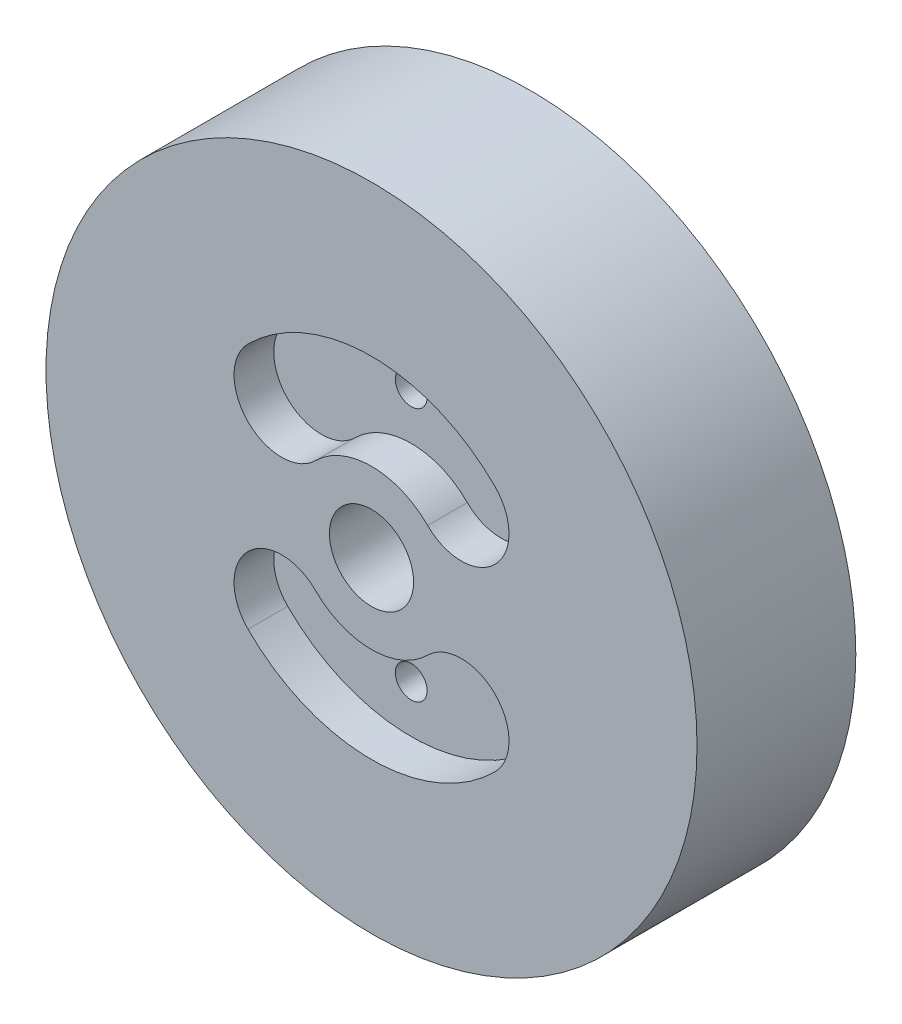
ISO-10303-21;
HEADER;
FILE_DESCRIPTION(('STEP AP214'),'2;1');
FILE_NAME('part.step','',(''),(''),'','','');
FILE_SCHEMA(('AUTOMOTIVE_DESIGN { 1 0 10303 214 1 1 1 1 }'));
ENDSEC;
DATA;
#1=APPLICATION_CONTEXT('core data for automotive mechanical design processes');
#2=APPLICATION_PROTOCOL_DEFINITION('international standard','automotive_design',2000,#1);
#3=PRODUCT_CONTEXT('',#1,'mechanical');
#4=PRODUCT('Part','Part','',(#3));
#5=PRODUCT_RELATED_PRODUCT_CATEGORY('part','',(#4));
#6=PRODUCT_DEFINITION_FORMATION('','',#4);
#7=PRODUCT_DEFINITION_CONTEXT('part definition',#1,'design');
#8=PRODUCT_DEFINITION('design','',#6,#7);
#9=PRODUCT_DEFINITION_SHAPE('','',#8);
#10=(LENGTH_UNIT() NAMED_UNIT(*) SI_UNIT(.MILLI.,.METRE.));
#11=(NAMED_UNIT(*) PLANE_ANGLE_UNIT() SI_UNIT($,.RADIAN.));
#12=(NAMED_UNIT(*) SI_UNIT($,.STERADIAN.) SOLID_ANGLE_UNIT());
#13=UNCERTAINTY_MEASURE_WITH_UNIT(LENGTH_MEASURE(1.E-05),#10,'distance_accuracy_value','');
#14=(GEOMETRIC_REPRESENTATION_CONTEXT(3) GLOBAL_UNCERTAINTY_ASSIGNED_CONTEXT((#13)) GLOBAL_UNIT_ASSIGNED_CONTEXT((#10,
#11,#12)) REPRESENTATION_CONTEXT('',''));
#15=CARTESIAN_POINT('',(0.,0.,0.));
#16=DIRECTION('',(0.,0.,1.));
#17=DIRECTION('',(1.,0.,0.));
#18=AXIS2_PLACEMENT_3D('',#15,#16,#17);
#19=CARTESIAN_POINT('',(0.,0.,5.));
#20=DIRECTION('',(0.,0.,-1.));
#21=DIRECTION('',(-1.,0.,0.));
#22=AXIS2_PLACEMENT_3D('',#19,#20,#21);
#23=CYLINDRICAL_SURFACE('',#22,20.5);
#24=CARTESIAN_POINT('',(0.,0.,5.));
#25=DIRECTION('',(0.,0.,1.));
#26=DIRECTION('',(1.,0.,0.));
#27=AXIS2_PLACEMENT_3D('',#24,#25,#26);
#28=CIRCLE('',#27,20.5);
#29=CARTESIAN_POINT('',(20.5,0.,5.));
#30=VERTEX_POINT('',#29);
#31=EDGE_CURVE('E11',#30,#30,#28,.T.);
#32=ORIENTED_EDGE('',*,*,#31,.F.);
#33=EDGE_LOOP('',(#32));
#34=FACE_BOUND('',#33,.T.);
#35=CARTESIAN_POINT('',(0.,0.,-5.));
#36=DIRECTION('',(0.,0.,1.));
#37=DIRECTION('',(1.,0.,0.));
#38=AXIS2_PLACEMENT_3D('',#35,#36,#37);
#39=CIRCLE('',#38,20.5);
#40=CARTESIAN_POINT('',(20.5,0.,-5.));
#41=VERTEX_POINT('',#40);
#42=EDGE_CURVE('E35',#41,#41,#39,.T.);
#43=ORIENTED_EDGE('',*,*,#42,.T.);
#44=EDGE_LOOP('',(#43));
#45=FACE_BOUND('',#44,.T.);
#46=ADVANCED_FACE('F32',(#34,#45),#23,.T.);
#47=CARTESIAN_POINT('',(0.,0.,5.));
#48=DIRECTION('',(0.,0.,1.));
#49=DIRECTION('',(1.,0.,0.));
#50=AXIS2_PLACEMENT_3D('',#47,#48,#49);
#51=PLANE('',#50);
#52=CARTESIAN_POINT('',(-5.65685424949237,-5.65685424949239,5.));
#53=DIRECTION('',(0.,0.,1.));
#54=DIRECTION('',(-1.,0.,0.));
#55=AXIS2_PLACEMENT_3D('',#52,#53,#54);
#56=CIRCLE('',#55,3.);
#57=CARTESIAN_POINT('',(-3.53553390593273,-3.53553390593274,5.));
#58=VERTEX_POINT('',#57);
#59=CARTESIAN_POINT('',(-7.77817459305201,-7.77817459305204,5.));
#60=VERTEX_POINT('',#59);
#61=EDGE_CURVE('E46',#58,#60,#56,.T.);
#62=ORIENTED_EDGE('',*,*,#61,.F.);
#63=CARTESIAN_POINT('',(0.,0.,5.));
#64=DIRECTION('',(0.,0.,-1.));
#65=DIRECTION('',(-1.,0.,0.));
#66=AXIS2_PLACEMENT_3D('',#63,#64,#65);
#67=CIRCLE('',#66,5.);
#68=CARTESIAN_POINT('',(3.53553390593273,-3.53553390593274,5.));
#69=VERTEX_POINT('',#68);
#70=EDGE_CURVE('E116',#69,#58,#67,.T.);
#71=ORIENTED_EDGE('',*,*,#70,.F.);
#72=CARTESIAN_POINT('',(5.65685424949237,-5.65685424949239,5.));
#73=DIRECTION('',(0.,0.,1.));
#74=DIRECTION('',(-1.,0.,0.));
#75=AXIS2_PLACEMENT_3D('',#72,#73,#74);
#76=CIRCLE('',#75,3.);
#77=CARTESIAN_POINT('',(7.77817459305201,-7.77817459305204,5.));
#78=VERTEX_POINT('',#77);
#79=EDGE_CURVE('E119',#78,#69,#76,.T.);
#80=ORIENTED_EDGE('',*,*,#79,.F.);
#81=CARTESIAN_POINT('',(0.,0.,5.));
#82=DIRECTION('',(0.,0.,1.));
#83=DIRECTION('',(-1.,0.,0.));
#84=AXIS2_PLACEMENT_3D('',#81,#82,#83);
#85=CIRCLE('',#84,11.);
#86=EDGE_CURVE('E128',#60,#78,#85,.T.);
#87=ORIENTED_EDGE('',*,*,#86,.F.);
#88=EDGE_LOOP('',(#62,#71,#80,#87));
#89=FACE_BOUND('',#88,.T.);
#90=CARTESIAN_POINT('',(5.65685424949237,5.65685424949239,5.));
#91=DIRECTION('',(0.,0.,1.));
#92=DIRECTION('',(1.,0.,0.));
#93=AXIS2_PLACEMENT_3D('',#90,#91,#92);
#94=CIRCLE('',#93,3.);
#95=CARTESIAN_POINT('',(3.53553390593273,3.53553390593274,5.));
#96=VERTEX_POINT('',#95);
#97=CARTESIAN_POINT('',(7.77817459305201,7.77817459305204,5.));
#98=VERTEX_POINT('',#97);
#99=EDGE_CURVE('E54',#96,#98,#94,.T.);
#100=ORIENTED_EDGE('',*,*,#99,.F.);
#101=CARTESIAN_POINT('',(0.,0.,5.));
#102=DIRECTION('',(0.,0.,-1.));
#103=DIRECTION('',(1.,0.,0.));
#104=AXIS2_PLACEMENT_3D('',#101,#102,#103);
#105=CIRCLE('',#104,5.);
#106=CARTESIAN_POINT('',(-3.53553390593273,3.53553390593274,5.));
#107=VERTEX_POINT('',#106);
#108=EDGE_CURVE('E147',#107,#96,#105,.T.);
#109=ORIENTED_EDGE('',*,*,#108,.F.);
#110=CARTESIAN_POINT('',(-5.65685424949237,5.65685424949239,5.));
#111=DIRECTION('',(0.,0.,1.));
#112=DIRECTION('',(1.,0.,0.));
#113=AXIS2_PLACEMENT_3D('',#110,#111,#112);
#114=CIRCLE('',#113,3.);
#115=CARTESIAN_POINT('',(-7.77817459305201,7.77817459305204,5.));
#116=VERTEX_POINT('',#115);
#117=EDGE_CURVE('E161',#116,#107,#114,.T.);
#118=ORIENTED_EDGE('',*,*,#117,.F.);
#119=CARTESIAN_POINT('',(0.,0.,5.));
#120=DIRECTION('',(0.,0.,1.));
#121=DIRECTION('',(1.,0.,0.));
#122=AXIS2_PLACEMENT_3D('',#119,#120,#121);
#123=CIRCLE('',#122,11.);
#124=EDGE_CURVE('E158',#98,#116,#123,.T.);
#125=ORIENTED_EDGE('',*,*,#124,.F.);
#126=EDGE_LOOP('',(#100,#109,#118,#125));
#127=FACE_BOUND('',#126,.T.);
#128=CARTESIAN_POINT('',(0.,0.,5.));
#129=DIRECTION('',(0.,0.,1.));
#130=DIRECTION('',(1.,0.,0.));
#131=AXIS2_PLACEMENT_3D('',#128,#129,#130);
#132=CIRCLE('',#131,2.64999999999999);
#133=CARTESIAN_POINT('',(2.64999999999999,0.,5.));
#134=VERTEX_POINT('',#133);
#135=EDGE_CURVE('E185',#134,#134,#132,.T.);
#136=ORIENTED_EDGE('',*,*,#135,.F.);
#137=EDGE_LOOP('',(#136));
#138=FACE_BOUND('',#137,.T.);
#139=ORIENTED_EDGE('',*,*,#31,.T.);
#140=EDGE_LOOP('',(#139));
#141=FACE_BOUND('',#140,.T.);
#142=ADVANCED_FACE('F199',(#89,#127,#138,#141),#51,.T.);
#143=CARTESIAN_POINT('',(0.,0.,-5.));
#144=DIRECTION('',(0.,0.,1.));
#145=DIRECTION('',(1.,0.,0.));
#146=AXIS2_PLACEMENT_3D('',#143,#144,#145);
#147=PLANE('',#146);
#148=CARTESIAN_POINT('',(0.,-8.,-5.));
#149=DIRECTION('',(0.,0.,1.));
#150=DIRECTION('',(1.,0.,0.));
#151=AXIS2_PLACEMENT_3D('',#148,#149,#150);
#152=CIRCLE('',#151,0.999999999999999);
#153=CARTESIAN_POINT('',(0.999999999999998,-8.,-5.));
#154=VERTEX_POINT('',#153);
#155=EDGE_CURVE('E122',#154,#154,#152,.T.);
#156=ORIENTED_EDGE('',*,*,#155,.T.);
#157=EDGE_LOOP('',(#156));
#158=FACE_BOUND('',#157,.T.);
#159=CARTESIAN_POINT('',(0.,8.,-5.));
#160=DIRECTION('',(0.,0.,1.));
#161=DIRECTION('',(1.,0.,0.));
#162=AXIS2_PLACEMENT_3D('',#159,#160,#161);
#163=CIRCLE('',#162,0.999999999999999);
#164=CARTESIAN_POINT('',(0.999999999999999,8.,-5.));
#165=VERTEX_POINT('',#164);
#166=EDGE_CURVE('E140',#165,#165,#163,.T.);
#167=ORIENTED_EDGE('',*,*,#166,.T.);
#168=EDGE_LOOP('',(#167));
#169=FACE_BOUND('',#168,.T.);
#170=CARTESIAN_POINT('',(12.5,0.,-5.));
#171=DIRECTION('',(0.,0.,-1.));
#172=DIRECTION('',(-1.,0.,0.));
#173=AXIS2_PLACEMENT_3D('',#170,#171,#172);
#174=CIRCLE('',#173,2.64999999999999);
#175=CARTESIAN_POINT('',(9.85000000000001,0.,-5.));
#176=VERTEX_POINT('',#175);
#177=EDGE_CURVE('E168',#176,#176,#174,.T.);
#178=ORIENTED_EDGE('',*,*,#177,.F.);
#179=EDGE_LOOP('',(#178));
#180=FACE_BOUND('',#179,.T.);
#181=CARTESIAN_POINT('',(-12.5,0.,-5.));
#182=DIRECTION('',(0.,0.,-1.));
#183=DIRECTION('',(-1.,0.,0.));
#184=AXIS2_PLACEMENT_3D('',#181,#182,#183);
#185=CIRCLE('',#184,2.64999999999999);
#186=CARTESIAN_POINT('',(-15.15,0.,-5.));
#187=VERTEX_POINT('',#186);
#188=EDGE_CURVE('E179',#187,#187,#185,.T.);
#189=ORIENTED_EDGE('',*,*,#188,.F.);
#190=EDGE_LOOP('',(#189));
#191=FACE_BOUND('',#190,.T.);
#192=CARTESIAN_POINT('',(0.,0.,-5.));
#193=DIRECTION('',(0.,0.,1.));
#194=DIRECTION('',(1.,0.,0.));
#195=AXIS2_PLACEMENT_3D('',#192,#193,#194);
#196=CIRCLE('',#195,2.65);
#197=CARTESIAN_POINT('',(2.65,0.,-5.));
#198=VERTEX_POINT('',#197);
#199=EDGE_CURVE('E188',#198,#198,#196,.T.);
#200=ORIENTED_EDGE('',*,*,#199,.T.);
#201=EDGE_LOOP('',(#200));
#202=FACE_BOUND('',#201,.T.);
#203=ORIENTED_EDGE('',*,*,#42,.F.);
#204=EDGE_LOOP('',(#203));
#205=FACE_BOUND('',#204,.T.);
#206=ADVANCED_FACE('F196',(#158,#169,#180,#191,#202,#205),#147,.F.);
#207=CARTESIAN_POINT('',(0.,0.,5.));
#208=DIRECTION('',(0.,0.,1.));
#209=DIRECTION('',(1.,0.,0.));
#210=AXIS2_PLACEMENT_3D('',#207,#208,#209);
#211=CYLINDRICAL_SURFACE('',#210,2.64999999999999);
#212=ORIENTED_EDGE('',*,*,#199,.F.);
#213=EDGE_LOOP('',(#212));
#214=FACE_BOUND('',#213,.T.);
#215=ORIENTED_EDGE('',*,*,#135,.T.);
#216=EDGE_LOOP('',(#215));
#217=FACE_BOUND('',#216,.T.);
#218=ADVANCED_FACE('F198',(#214,#217),#211,.F.);
#219=CARTESIAN_POINT('',(-12.5,0.,0.));
#220=DIRECTION('',(0.,0.,1.));
#221=DIRECTION('',(1.,0.,0.));
#222=AXIS2_PLACEMENT_3D('',#219,#220,#221);
#223=PLANE('',#222);
#224=CARTESIAN_POINT('',(-12.5,0.,0.));
#225=DIRECTION('',(0.,0.,-1.));
#226=DIRECTION('',(-1.,0.,0.));
#227=AXIS2_PLACEMENT_3D('',#224,#225,#226);
#228=CIRCLE('',#227,2.65);
#229=CARTESIAN_POINT('',(-15.15,0.,0.));
#230=VERTEX_POINT('',#229);
#231=EDGE_CURVE('E182',#230,#230,#228,.T.);
#232=ORIENTED_EDGE('',*,*,#231,.T.);
#233=EDGE_LOOP('',(#232));
#234=FACE_BOUND('',#233,.T.);
#235=ADVANCED_FACE('F205',(#234),#223,.F.);
#236=CARTESIAN_POINT('',(-12.5,0.,-5.));
#237=DIRECTION('',(0.,0.,-1.));
#238=DIRECTION('',(-1.,0.,0.));
#239=AXIS2_PLACEMENT_3D('',#236,#237,#238);
#240=CYLINDRICAL_SURFACE('',#239,2.64999999999999);
#241=ORIENTED_EDGE('',*,*,#231,.F.);
#242=EDGE_LOOP('',(#241));
#243=FACE_BOUND('',#242,.T.);
#244=ORIENTED_EDGE('',*,*,#188,.T.);
#245=EDGE_LOOP('',(#244));
#246=FACE_BOUND('',#245,.T.);
#247=ADVANCED_FACE('F324',(#243,#246),#240,.F.);
#248=CARTESIAN_POINT('',(12.5,0.,0.));
#249=DIRECTION('',(0.,0.,1.));
#250=DIRECTION('',(1.,0.,0.));
#251=AXIS2_PLACEMENT_3D('',#248,#249,#250);
#252=PLANE('',#251);
#253=CARTESIAN_POINT('',(12.5,0.,0.));
#254=DIRECTION('',(0.,0.,-1.));
#255=DIRECTION('',(-1.,0.,0.));
#256=AXIS2_PLACEMENT_3D('',#253,#254,#255);
#257=CIRCLE('',#256,2.65);
#258=CARTESIAN_POINT('',(9.85,0.,0.));
#259=VERTEX_POINT('',#258);
#260=EDGE_CURVE('E176',#259,#259,#257,.T.);
#261=ORIENTED_EDGE('',*,*,#260,.T.);
#262=EDGE_LOOP('',(#261));
#263=FACE_BOUND('',#262,.T.);
#264=ADVANCED_FACE('F320',(#263),#252,.F.);
#265=CARTESIAN_POINT('',(12.5,0.,-5.));
#266=DIRECTION('',(0.,0.,-1.));
#267=DIRECTION('',(-1.,0.,0.));
#268=AXIS2_PLACEMENT_3D('',#265,#266,#267);
#269=CYLINDRICAL_SURFACE('',#268,2.64999999999999);
#270=ORIENTED_EDGE('',*,*,#260,.F.);
#271=EDGE_LOOP('',(#270));
#272=FACE_BOUND('',#271,.T.);
#273=ORIENTED_EDGE('',*,*,#177,.T.);
#274=EDGE_LOOP('',(#273));
#275=FACE_BOUND('',#274,.T.);
#276=ADVANCED_FACE('F317',(#272,#275),#269,.F.);
#277=CARTESIAN_POINT('',(5.65685424949237,5.65685424949239,2.5));
#278=DIRECTION('',(0.,0.,1.));
#279=DIRECTION('',(1.,0.,0.));
#280=AXIS2_PLACEMENT_3D('',#277,#278,#279);
#281=CYLINDRICAL_SURFACE('',#280,3.);
#282=ORIENTED_EDGE('',*,*,#99,.T.);
#283=DIRECTION('',(0.,0.,1.));
#284=VECTOR('',#283,1.);
#285=CARTESIAN_POINT('',(7.77817459305201,7.77817459305204,2.5));
#286=LINE('',#285,#284);
#287=CARTESIAN_POINT('',(7.77817459305201,7.77817459305204,2.5));
#288=VERTEX_POINT('',#287);
#289=EDGE_CURVE('E156',#288,#98,#286,.T.);
#290=ORIENTED_EDGE('',*,*,#289,.F.);
#291=CARTESIAN_POINT('',(5.65685424949237,5.65685424949239,2.5));
#292=DIRECTION('',(0.,0.,1.));
#293=DIRECTION('',(1.,0.,0.));
#294=AXIS2_PLACEMENT_3D('',#291,#292,#293);
#295=CIRCLE('',#294,3.);
#296=CARTESIAN_POINT('',(3.53553390593273,3.53553390593274,2.5));
#297=VERTEX_POINT('',#296);
#298=EDGE_CURVE('E143',#297,#288,#295,.T.);
#299=ORIENTED_EDGE('',*,*,#298,.F.);
#300=DIRECTION('',(0.,0.,1.));
#301=VECTOR('',#300,1.);
#302=CARTESIAN_POINT('',(3.53553390593273,3.53553390593274,2.5));
#303=LINE('',#302,#301);
#304=EDGE_CURVE('E166',#297,#96,#303,.T.);
#305=ORIENTED_EDGE('',*,*,#304,.T.);
#306=EDGE_LOOP('',(#282,#290,#299,#305));
#307=FACE_BOUND('',#306,.T.);
#308=ADVANCED_FACE('F307',(#307),#281,.F.);
#309=CARTESIAN_POINT('',(0.,0.,2.5));
#310=DIRECTION('',(0.,0.,1.));
#311=DIRECTION('',(1.,0.,0.));
#312=AXIS2_PLACEMENT_3D('',#309,#310,#311);
#313=CYLINDRICAL_SURFACE('',#312,5.);
#314=ORIENTED_EDGE('',*,*,#108,.T.);
#315=ORIENTED_EDGE('',*,*,#304,.F.);
#316=CARTESIAN_POINT('',(0.,0.,2.5));
#317=DIRECTION('',(0.,0.,-1.));
#318=DIRECTION('',(1.,0.,0.));
#319=AXIS2_PLACEMENT_3D('',#316,#317,#318);
#320=CIRCLE('',#319,5.);
#321=CARTESIAN_POINT('',(-3.53553390593273,3.53553390593274,2.5));
#322=VERTEX_POINT('',#321);
#323=EDGE_CURVE('E153',#322,#297,#320,.T.);
#324=ORIENTED_EDGE('',*,*,#323,.F.);
#325=DIRECTION('',(0.,0.,1.));
#326=VECTOR('',#325,1.);
#327=CARTESIAN_POINT('',(-3.53553390593273,3.53553390593274,2.5));
#328=LINE('',#327,#326);
#329=EDGE_CURVE('E169',#322,#107,#328,.T.);
#330=ORIENTED_EDGE('',*,*,#329,.T.);
#331=EDGE_LOOP('',(#314,#315,#324,#330));
#332=FACE_BOUND('',#331,.T.);
#333=ADVANCED_FACE('F303',(#332),#313,.T.);
#334=CARTESIAN_POINT('',(-5.65685424949237,5.65685424949239,2.5));
#335=DIRECTION('',(0.,0.,1.));
#336=DIRECTION('',(1.,0.,0.));
#337=AXIS2_PLACEMENT_3D('',#334,#335,#336);
#338=CYLINDRICAL_SURFACE('',#337,3.);
#339=ORIENTED_EDGE('',*,*,#117,.T.);
#340=ORIENTED_EDGE('',*,*,#329,.F.);
#341=CARTESIAN_POINT('',(-5.65685424949237,5.65685424949239,2.5));
#342=DIRECTION('',(0.,0.,1.));
#343=DIRECTION('',(1.,0.,0.));
#344=AXIS2_PLACEMENT_3D('',#341,#342,#343);
#345=CIRCLE('',#344,3.);
#346=CARTESIAN_POINT('',(-7.77817459305201,7.77817459305204,2.5));
#347=VERTEX_POINT('',#346);
#348=EDGE_CURVE('E150',#347,#322,#345,.T.);
#349=ORIENTED_EDGE('',*,*,#348,.F.);
#350=DIRECTION('',(0.,0.,1.));
#351=VECTOR('',#350,1.);
#352=CARTESIAN_POINT('',(-7.77817459305201,7.77817459305204,2.5));
#353=LINE('',#352,#351);
#354=EDGE_CURVE('E171',#347,#116,#353,.T.);
#355=ORIENTED_EDGE('',*,*,#354,.T.);
#356=EDGE_LOOP('',(#339,#340,#349,#355));
#357=FACE_BOUND('',#356,.T.);
#358=ADVANCED_FACE('F306',(#357),#338,.F.);
#359=CARTESIAN_POINT('',(0.,0.,2.5));
#360=DIRECTION('',(0.,0.,1.));
#361=DIRECTION('',(1.,0.,0.));
#362=AXIS2_PLACEMENT_3D('',#359,#360,#361);
#363=CYLINDRICAL_SURFACE('',#362,11.);
#364=ORIENTED_EDGE('',*,*,#124,.T.);
#365=ORIENTED_EDGE('',*,*,#354,.F.);
#366=CARTESIAN_POINT('',(0.,0.,2.5));
#367=DIRECTION('',(0.,0.,1.));
#368=DIRECTION('',(1.,0.,0.));
#369=AXIS2_PLACEMENT_3D('',#366,#367,#368);
#370=CIRCLE('',#369,11.);
#371=EDGE_CURVE('E146',#288,#347,#370,.T.);
#372=ORIENTED_EDGE('',*,*,#371,.F.);
#373=ORIENTED_EDGE('',*,*,#289,.T.);
#374=EDGE_LOOP('',(#364,#365,#372,#373));
#375=FACE_BOUND('',#374,.T.);
#376=ADVANCED_FACE('F301',(#375),#363,.F.);
#377=CARTESIAN_POINT('',(2.82842712474619,2.8284271247462,2.5));
#378=DIRECTION('',(0.,0.,1.));
#379=DIRECTION('',(1.,0.,0.));
#380=AXIS2_PLACEMENT_3D('',#377,#378,#379);
#381=PLANE('',#380);
#382=CARTESIAN_POINT('',(0.,8.,2.5));
#383=DIRECTION('',(0.,0.,1.));
#384=DIRECTION('',(1.,0.,0.));
#385=AXIS2_PLACEMENT_3D('',#382,#383,#384);
#386=CIRCLE('',#385,0.999999999999999);
#387=CARTESIAN_POINT('',(1.,8.,2.5));
#388=VERTEX_POINT('',#387);
#389=EDGE_CURVE('E134',#388,#388,#386,.T.);
#390=ORIENTED_EDGE('',*,*,#389,.F.);
#391=EDGE_LOOP('',(#390));
#392=FACE_BOUND('',#391,.T.);
#393=ORIENTED_EDGE('',*,*,#298,.T.);
#394=ORIENTED_EDGE('',*,*,#371,.T.);
#395=ORIENTED_EDGE('',*,*,#348,.T.);
#396=ORIENTED_EDGE('',*,*,#323,.T.);
#397=EDGE_LOOP('',(#393,#394,#395,#396));
#398=FACE_BOUND('',#397,.T.);
#399=ADVANCED_FACE('F297',(#392,#398),#381,.T.);
#400=CARTESIAN_POINT('',(0.,8.,2.5));
#401=DIRECTION('',(0.,0.,1.));
#402=DIRECTION('',(1.,0.,0.));
#403=AXIS2_PLACEMENT_3D('',#400,#401,#402);
#404=CYLINDRICAL_SURFACE('',#403,0.999999999999999);
#405=ORIENTED_EDGE('',*,*,#166,.F.);
#406=EDGE_LOOP('',(#405));
#407=FACE_BOUND('',#406,.T.);
#408=ORIENTED_EDGE('',*,*,#389,.T.);
#409=EDGE_LOOP('',(#408));
#410=FACE_BOUND('',#409,.T.);
#411=ADVANCED_FACE('F229',(#407,#410),#404,.F.);
#412=CARTESIAN_POINT('',(-5.65685424949237,-5.65685424949239,2.5));
#413=DIRECTION('',(0.,0.,1.));
#414=DIRECTION('',(1.,0.,0.));
#415=AXIS2_PLACEMENT_3D('',#412,#413,#414);
#416=CYLINDRICAL_SURFACE('',#415,3.);
#417=ORIENTED_EDGE('',*,*,#61,.T.);
#418=DIRECTION('',(0.,0.,1.));
#419=VECTOR('',#418,1.);
#420=CARTESIAN_POINT('',(-7.77817459305201,-7.77817459305204,2.5));
#421=LINE('',#420,#419);
#422=CARTESIAN_POINT('',(-7.77817459305201,-7.77817459305204,2.5));
#423=VERTEX_POINT('',#422);
#424=EDGE_CURVE('E94',#423,#60,#421,.T.);
#425=ORIENTED_EDGE('',*,*,#424,.F.);
#426=CARTESIAN_POINT('',(-5.65685424949237,-5.65685424949239,2.5));
#427=DIRECTION('',(0.,0.,1.));
#428=DIRECTION('',(-1.,0.,0.));
#429=AXIS2_PLACEMENT_3D('',#426,#427,#428);
#430=CIRCLE('',#429,3.);
#431=CARTESIAN_POINT('',(-3.53553390593273,-3.53553390593274,2.5));
#432=VERTEX_POINT('',#431);
#433=EDGE_CURVE('E98',#432,#423,#430,.T.);
#434=ORIENTED_EDGE('',*,*,#433,.F.);
#435=DIRECTION('',(0.,0.,1.));
#436=VECTOR('',#435,1.);
#437=CARTESIAN_POINT('',(-3.53553390593273,-3.53553390593274,2.5));
#438=LINE('',#437,#436);
#439=EDGE_CURVE('E132',#432,#58,#438,.T.);
#440=ORIENTED_EDGE('',*,*,#439,.T.);
#441=EDGE_LOOP('',(#417,#425,#434,#440));
#442=FACE_BOUND('',#441,.T.);
#443=ADVANCED_FACE('F96',(#442),#416,.F.);
#444=CARTESIAN_POINT('',(0.,0.,2.5));
#445=DIRECTION('',(0.,0.,1.));
#446=DIRECTION('',(1.,0.,0.));
#447=AXIS2_PLACEMENT_3D('',#444,#445,#446);
#448=CYLINDRICAL_SURFACE('',#447,5.);
#449=ORIENTED_EDGE('',*,*,#70,.T.);
#450=ORIENTED_EDGE('',*,*,#439,.F.);
#451=CARTESIAN_POINT('',(0.,0.,2.5));
#452=DIRECTION('',(0.,0.,-1.));
#453=DIRECTION('',(-1.,0.,0.));
#454=AXIS2_PLACEMENT_3D('',#451,#452,#453);
#455=CIRCLE('',#454,5.);
#456=CARTESIAN_POINT('',(3.53553390593273,-3.53553390593274,2.5));
#457=VERTEX_POINT('',#456);
#458=EDGE_CURVE('E104',#457,#432,#455,.T.);
#459=ORIENTED_EDGE('',*,*,#458,.F.);
#460=DIRECTION('',(0.,0.,1.));
#461=VECTOR('',#460,1.);
#462=CARTESIAN_POINT('',(3.53553390593273,-3.53553390593274,2.5));
#463=LINE('',#462,#461);
#464=EDGE_CURVE('E135',#457,#69,#463,.T.);
#465=ORIENTED_EDGE('',*,*,#464,.T.);
#466=EDGE_LOOP('',(#449,#450,#459,#465));
#467=FACE_BOUND('',#466,.T.);
#468=ADVANCED_FACE('F243',(#467),#448,.T.);
#469=CARTESIAN_POINT('',(5.65685424949237,-5.65685424949239,2.5));
#470=DIRECTION('',(0.,0.,1.));
#471=DIRECTION('',(1.,0.,0.));
#472=AXIS2_PLACEMENT_3D('',#469,#470,#471);
#473=CYLINDRICAL_SURFACE('',#472,3.);
#474=ORIENTED_EDGE('',*,*,#79,.T.);
#475=ORIENTED_EDGE('',*,*,#464,.F.);
#476=CARTESIAN_POINT('',(5.65685424949237,-5.65685424949239,2.5));
#477=DIRECTION('',(0.,0.,1.));
#478=DIRECTION('',(-1.,0.,0.));
#479=AXIS2_PLACEMENT_3D('',#476,#477,#478);
#480=CIRCLE('',#479,3.);
#481=CARTESIAN_POINT('',(7.77817459305201,-7.77817459305204,2.5));
#482=VERTEX_POINT('',#481);
#483=EDGE_CURVE('E112',#482,#457,#480,.T.);
#484=ORIENTED_EDGE('',*,*,#483,.F.);
#485=DIRECTION('',(0.,0.,1.));
#486=VECTOR('',#485,1.);
#487=CARTESIAN_POINT('',(7.77817459305201,-7.77817459305204,2.5));
#488=LINE('',#487,#486);
#489=EDGE_CURVE('E103',#482,#78,#488,.T.);
#490=ORIENTED_EDGE('',*,*,#489,.T.);
#491=EDGE_LOOP('',(#474,#475,#484,#490));
#492=FACE_BOUND('',#491,.T.);
#493=ADVANCED_FACE('F252',(#492),#473,.F.);
#494=CARTESIAN_POINT('',(0.,0.,2.5));
#495=DIRECTION('',(0.,0.,1.));
#496=DIRECTION('',(1.,0.,0.));
#497=AXIS2_PLACEMENT_3D('',#494,#495,#496);
#498=CYLINDRICAL_SURFACE('',#497,11.);
#499=ORIENTED_EDGE('',*,*,#86,.T.);
#500=ORIENTED_EDGE('',*,*,#489,.F.);
#501=CARTESIAN_POINT('',(0.,0.,2.5));
#502=DIRECTION('',(0.,0.,1.));
#503=DIRECTION('',(-1.,0.,0.));
#504=AXIS2_PLACEMENT_3D('',#501,#502,#503);
#505=CIRCLE('',#504,11.);
#506=EDGE_CURVE('E107',#423,#482,#505,.T.);
#507=ORIENTED_EDGE('',*,*,#506,.F.);
#508=ORIENTED_EDGE('',*,*,#424,.T.);
#509=EDGE_LOOP('',(#499,#500,#507,#508));
#510=FACE_BOUND('',#509,.T.);
#511=ADVANCED_FACE('F108',(#510),#498,.F.);
#512=CARTESIAN_POINT('',(-2.82842712474619,-2.8284271247462,2.5));
#513=DIRECTION('',(0.,0.,1.));
#514=DIRECTION('',(-1.,0.,0.));
#515=AXIS2_PLACEMENT_3D('',#512,#513,#514);
#516=PLANE('',#515);
#517=CARTESIAN_POINT('',(0.,-8.,2.5));
#518=DIRECTION('',(0.,0.,1.));
#519=DIRECTION('',(1.,0.,0.));
#520=AXIS2_PLACEMENT_3D('',#517,#518,#519);
#521=CIRCLE('',#520,0.999999999999999);
#522=CARTESIAN_POINT('',(0.999999999999999,-8.,2.5));
#523=VERTEX_POINT('',#522);
#524=EDGE_CURVE('E416',#523,#523,#521,.T.);
#525=ORIENTED_EDGE('',*,*,#524,.F.);
#526=EDGE_LOOP('',(#525));
#527=FACE_BOUND('',#526,.T.);
#528=ORIENTED_EDGE('',*,*,#433,.T.);
#529=ORIENTED_EDGE('',*,*,#506,.T.);
#530=ORIENTED_EDGE('',*,*,#483,.T.);
#531=ORIENTED_EDGE('',*,*,#458,.T.);
#532=EDGE_LOOP('',(#528,#529,#530,#531));
#533=FACE_BOUND('',#532,.T.);
#534=ADVANCED_FACE('F114',(#527,#533),#516,.T.);
#535=CARTESIAN_POINT('',(0.,-8.,2.5));
#536=DIRECTION('',(0.,0.,1.));
#537=DIRECTION('',(1.,0.,0.));
#538=AXIS2_PLACEMENT_3D('',#535,#536,#537);
#539=CYLINDRICAL_SURFACE('',#538,0.999999999999999);
#540=ORIENTED_EDGE('',*,*,#155,.F.);
#541=EDGE_LOOP('',(#540));
#542=FACE_BOUND('',#541,.T.);
#543=ORIENTED_EDGE('',*,*,#524,.T.);
#544=EDGE_LOOP('',(#543));
#545=FACE_BOUND('',#544,.T.);
#546=ADVANCED_FACE('F279',(#542,#545),#539,.F.);
#547=CLOSED_SHELL('',(#46,#142,#206,#218,#235,#247,#264,#276,#308,#333,#358,#376,#399,#411,#443,
#468,#493,#511,#534,#546));
#548=MANIFOLD_SOLID_BREP('B2',#547);
#549=ADVANCED_BREP_SHAPE_REPRESENTATION('',(#18,#548),#14);
#550=SHAPE_DEFINITION_REPRESENTATION(#9,#549);
ENDSEC;
END-ISO-10303-21;
